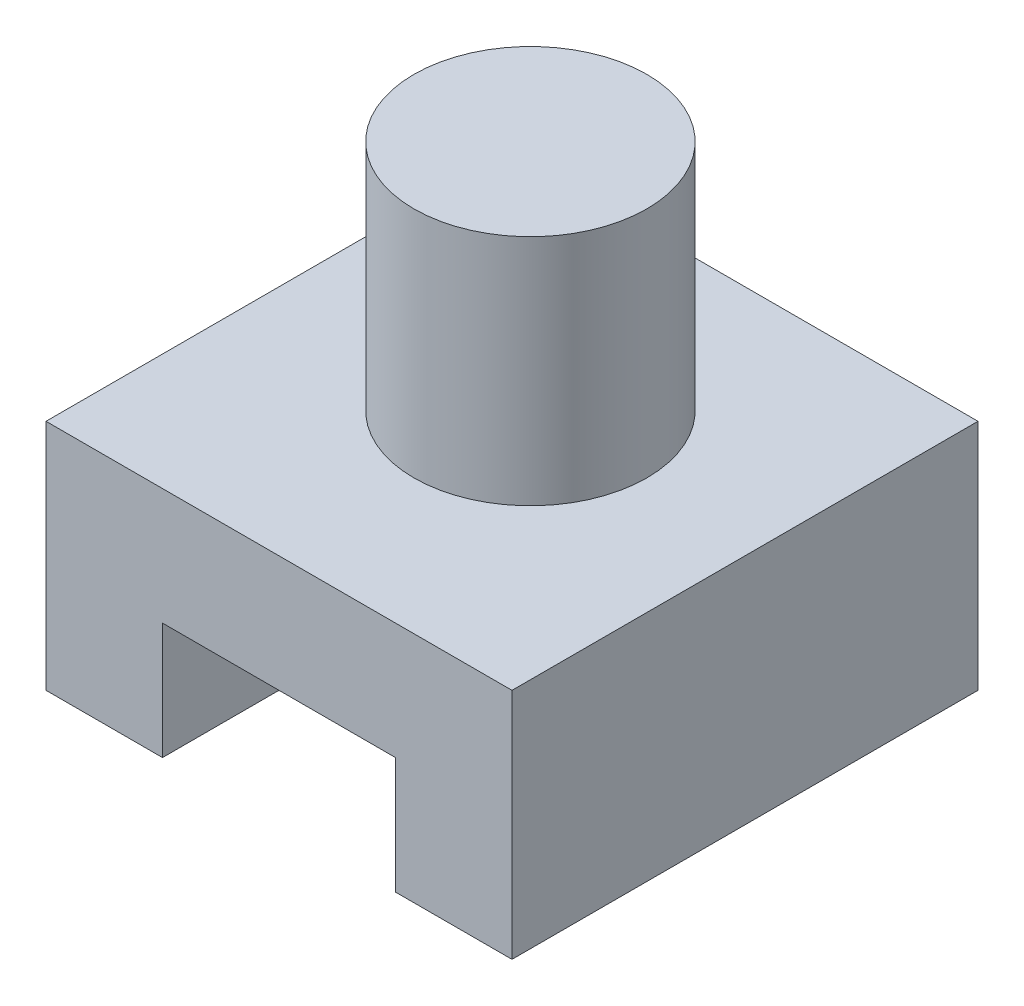
ISO-10303-21;
HEADER;
FILE_DESCRIPTION(('STEP AP214'),'2;1');
FILE_NAME('part.step','',(''),(''),'','','');
FILE_SCHEMA(('AUTOMOTIVE_DESIGN { 1 0 10303 214 1 1 1 1 }'));
ENDSEC;
DATA;
#1=APPLICATION_CONTEXT('core data for automotive mechanical design processes');
#2=APPLICATION_PROTOCOL_DEFINITION('international standard','automotive_design',2000,#1);
#3=PRODUCT_CONTEXT('',#1,'mechanical');
#4=PRODUCT('Part','Part','',(#3));
#5=PRODUCT_RELATED_PRODUCT_CATEGORY('part','',(#4));
#6=PRODUCT_DEFINITION_FORMATION('','',#4);
#7=PRODUCT_DEFINITION_CONTEXT('part definition',#1,'design');
#8=PRODUCT_DEFINITION('design','',#6,#7);
#9=PRODUCT_DEFINITION_SHAPE('','',#8);
#10=(LENGTH_UNIT() NAMED_UNIT(*) SI_UNIT(.MILLI.,.METRE.));
#11=(NAMED_UNIT(*) PLANE_ANGLE_UNIT() SI_UNIT($,.RADIAN.));
#12=(NAMED_UNIT(*) SI_UNIT($,.STERADIAN.) SOLID_ANGLE_UNIT());
#13=UNCERTAINTY_MEASURE_WITH_UNIT(LENGTH_MEASURE(1.E-05),#10,'distance_accuracy_value','');
#14=(GEOMETRIC_REPRESENTATION_CONTEXT(3) GLOBAL_UNCERTAINTY_ASSIGNED_CONTEXT((#13)) GLOBAL_UNIT_ASSIGNED_CONTEXT((#10,
#11,#12)) REPRESENTATION_CONTEXT('',''));
#15=CARTESIAN_POINT('',(0.,0.,0.));
#16=DIRECTION('',(0.,0.,1.));
#17=DIRECTION('',(1.,0.,0.));
#18=AXIS2_PLACEMENT_3D('',#15,#16,#17);
#19=CARTESIAN_POINT('',(0.,20.,-40.));
#20=DIRECTION('',(1.,0.,0.));
#21=DIRECTION('',(0.,0.,-1.));
#22=AXIS2_PLACEMENT_3D('',#19,#20,#21);
#23=PLANE('',#22);
#24=DIRECTION('',(0.,0.,1.));
#25=VECTOR('',#24,1.);
#26=CARTESIAN_POINT('',(0.,0.,-40.));
#27=LINE('',#26,#25);
#28=CARTESIAN_POINT('',(0.,0.,-40.));
#29=VERTEX_POINT('',#28);
#30=CARTESIAN_POINT('',(0.,0.,0.));
#31=VERTEX_POINT('',#30);
#32=EDGE_CURVE('E149',#29,#31,#27,.T.);
#33=ORIENTED_EDGE('',*,*,#32,.T.);
#34=DIRECTION('',(0.,-1.,0.));
#35=VECTOR('',#34,1.);
#36=CARTESIAN_POINT('',(0.,20.,0.));
#37=LINE('',#36,#35);
#38=CARTESIAN_POINT('',(0.,20.,0.));
#39=VERTEX_POINT('',#38);
#40=EDGE_CURVE('E42',#39,#31,#37,.T.);
#41=ORIENTED_EDGE('',*,*,#40,.F.);
#42=DIRECTION('',(0.,0.,1.));
#43=VECTOR('',#42,1.);
#44=CARTESIAN_POINT('',(0.,20.,-40.));
#45=LINE('',#44,#43);
#46=CARTESIAN_POINT('',(0.,20.,-40.));
#47=VERTEX_POINT('',#46);
#48=EDGE_CURVE('E142',#47,#39,#45,.T.);
#49=ORIENTED_EDGE('',*,*,#48,.F.);
#50=DIRECTION('',(0.,-1.,0.));
#51=VECTOR('',#50,1.);
#52=CARTESIAN_POINT('',(0.,20.,-40.));
#53=LINE('',#52,#51);
#54=EDGE_CURVE('E148',#47,#29,#53,.T.);
#55=ORIENTED_EDGE('',*,*,#54,.T.);
#56=EDGE_LOOP('',(#33,#41,#49,#55));
#57=FACE_BOUND('',#56,.T.);
#58=ADVANCED_FACE('F39',(#57),#23,.F.);
#59=CARTESIAN_POINT('',(0.,20.,0.));
#60=DIRECTION('',(0.,0.,-1.));
#61=DIRECTION('',(-1.,0.,0.));
#62=AXIS2_PLACEMENT_3D('',#59,#60,#61);
#63=PLANE('',#62);
#64=DIRECTION('',(1.,0.,0.));
#65=VECTOR('',#64,1.);
#66=CARTESIAN_POINT('',(0.,0.,0.));
#67=LINE('',#66,#65);
#68=CARTESIAN_POINT('',(10.,0.,0.));
#69=VERTEX_POINT('',#68);
#70=EDGE_CURVE('E153',#31,#69,#67,.T.);
#71=ORIENTED_EDGE('',*,*,#70,.T.);
#72=DIRECTION('',(0.,-1.,0.));
#73=VECTOR('',#72,1.);
#74=CARTESIAN_POINT('',(10.,0.,0.));
#75=LINE('',#74,#73);
#76=CARTESIAN_POINT('',(10.,10.,0.));
#77=VERTEX_POINT('',#76);
#78=EDGE_CURVE('E130',#77,#69,#75,.T.);
#79=ORIENTED_EDGE('',*,*,#78,.F.);
#80=DIRECTION('',(-1.,0.,0.));
#81=VECTOR('',#80,1.);
#82=CARTESIAN_POINT('',(10.,10.,0.));
#83=LINE('',#82,#81);
#84=CARTESIAN_POINT('',(30.,10.,0.));
#85=VERTEX_POINT('',#84);
#86=EDGE_CURVE('E175',#85,#77,#83,.T.);
#87=ORIENTED_EDGE('',*,*,#86,.F.);
#88=DIRECTION('',(0.,1.,0.));
#89=VECTOR('',#88,1.);
#90=CARTESIAN_POINT('',(30.,10.,0.));
#91=LINE('',#90,#89);
#92=CARTESIAN_POINT('',(30.,0.,0.));
#93=VERTEX_POINT('',#92);
#94=EDGE_CURVE('E178',#93,#85,#91,.T.);
#95=ORIENTED_EDGE('',*,*,#94,.F.);
#96=CARTESIAN_POINT('',(40.,0.,0.));
#97=VERTEX_POINT('',#96);
#98=EDGE_CURVE('E135',#93,#97,#67,.T.);
#99=ORIENTED_EDGE('',*,*,#98,.T.);
#100=DIRECTION('',(0.,-1.,0.));
#101=VECTOR('',#100,1.);
#102=CARTESIAN_POINT('',(40.,20.,0.));
#103=LINE('',#102,#101);
#104=CARTESIAN_POINT('',(40.,20.,0.));
#105=VERTEX_POINT('',#104);
#106=EDGE_CURVE('E161',#105,#97,#103,.T.);
#107=ORIENTED_EDGE('',*,*,#106,.F.);
#108=DIRECTION('',(1.,0.,0.));
#109=VECTOR('',#108,1.);
#110=CARTESIAN_POINT('',(0.,20.,0.));
#111=LINE('',#110,#109);
#112=EDGE_CURVE('E92',#39,#105,#111,.T.);
#113=ORIENTED_EDGE('',*,*,#112,.F.);
#114=ORIENTED_EDGE('',*,*,#40,.T.);
#115=EDGE_LOOP('',(#71,#79,#87,#95,#99,#107,#113,#114));
#116=FACE_BOUND('',#115,.T.);
#117=ADVANCED_FACE('F166',(#116),#63,.F.);
#118=CARTESIAN_POINT('',(40.,20.,0.));
#119=DIRECTION('',(-1.,0.,0.));
#120=DIRECTION('',(0.,0.,1.));
#121=AXIS2_PLACEMENT_3D('',#118,#119,#120);
#122=PLANE('',#121);
#123=DIRECTION('',(0.,0.,-1.));
#124=VECTOR('',#123,1.);
#125=CARTESIAN_POINT('',(40.,0.,0.));
#126=LINE('',#125,#124);
#127=CARTESIAN_POINT('',(40.,0.,-40.));
#128=VERTEX_POINT('',#127);
#129=EDGE_CURVE('E156',#97,#128,#126,.T.);
#130=ORIENTED_EDGE('',*,*,#129,.T.);
#131=DIRECTION('',(0.,-1.,0.));
#132=VECTOR('',#131,1.);
#133=CARTESIAN_POINT('',(40.,20.,-40.));
#134=LINE('',#133,#132);
#135=CARTESIAN_POINT('',(40.,20.,-40.));
#136=VERTEX_POINT('',#135);
#137=EDGE_CURVE('E160',#136,#128,#134,.T.);
#138=ORIENTED_EDGE('',*,*,#137,.F.);
#139=DIRECTION('',(0.,0.,-1.));
#140=VECTOR('',#139,1.);
#141=CARTESIAN_POINT('',(40.,20.,0.));
#142=LINE('',#141,#140);
#143=EDGE_CURVE('E145',#105,#136,#142,.T.);
#144=ORIENTED_EDGE('',*,*,#143,.F.);
#145=ORIENTED_EDGE('',*,*,#106,.T.);
#146=EDGE_LOOP('',(#130,#138,#144,#145));
#147=FACE_BOUND('',#146,.T.);
#148=ADVANCED_FACE('F198',(#147),#122,.F.);
#149=CARTESIAN_POINT('',(40.,20.,-40.));
#150=DIRECTION('',(0.,0.,1.));
#151=DIRECTION('',(1.,0.,0.));
#152=AXIS2_PLACEMENT_3D('',#149,#150,#151);
#153=PLANE('',#152);
#154=DIRECTION('',(-1.,0.,0.));
#155=VECTOR('',#154,1.);
#156=CARTESIAN_POINT('',(40.,0.,-40.));
#157=LINE('',#156,#155);
#158=EDGE_CURVE('E84',#128,#29,#157,.T.);
#159=ORIENTED_EDGE('',*,*,#158,.T.);
#160=ORIENTED_EDGE('',*,*,#54,.F.);
#161=DIRECTION('',(-1.,0.,0.));
#162=VECTOR('',#161,1.);
#163=CARTESIAN_POINT('',(40.,20.,-40.));
#164=LINE('',#163,#162);
#165=EDGE_CURVE('E63',#136,#47,#164,.T.);
#166=ORIENTED_EDGE('',*,*,#165,.F.);
#167=ORIENTED_EDGE('',*,*,#137,.T.);
#168=EDGE_LOOP('',(#159,#160,#166,#167));
#169=FACE_BOUND('',#168,.T.);
#170=ADVANCED_FACE('F195',(#169),#153,.F.);
#171=CARTESIAN_POINT('',(0.,20.,0.));
#172=DIRECTION('',(0.,1.,0.));
#173=DIRECTION('',(0.,0.,1.));
#174=AXIS2_PLACEMENT_3D('',#171,#172,#173);
#175=PLANE('',#174);
#176=CARTESIAN_POINT('',(20.,20.,-21.5793527371334));
#177=DIRECTION('',(0.,1.,0.));
#178=DIRECTION('',(0.,0.,1.));
#179=AXIS2_PLACEMENT_3D('',#176,#177,#178);
#180=CIRCLE('',#179,10.);
#181=CARTESIAN_POINT('',(20.,20.,-11.5793527371334));
#182=VERTEX_POINT('',#181);
#183=EDGE_CURVE('E11',#182,#182,#180,.T.);
#184=ORIENTED_EDGE('',*,*,#183,.F.);
#185=EDGE_LOOP('',(#184));
#186=FACE_BOUND('',#185,.T.);
#187=ORIENTED_EDGE('',*,*,#48,.T.);
#188=ORIENTED_EDGE('',*,*,#112,.T.);
#189=ORIENTED_EDGE('',*,*,#143,.T.);
#190=ORIENTED_EDGE('',*,*,#165,.T.);
#191=EDGE_LOOP('',(#187,#188,#189,#190));
#192=FACE_BOUND('',#191,.T.);
#193=ADVANCED_FACE('F193',(#186,#192),#175,.T.);
#194=CARTESIAN_POINT('',(0.,0.,0.));
#195=DIRECTION('',(0.,1.,0.));
#196=DIRECTION('',(0.,0.,1.));
#197=AXIS2_PLACEMENT_3D('',#194,#195,#196);
#198=PLANE('',#197);
#199=DIRECTION('',(1.,0.,0.));
#200=VECTOR('',#199,1.);
#201=CARTESIAN_POINT('',(30.,0.,-20.));
#202=LINE('',#201,#200);
#203=CARTESIAN_POINT('',(10.,0.,-20.));
#204=VERTEX_POINT('',#203);
#205=CARTESIAN_POINT('',(30.,0.,-20.));
#206=VERTEX_POINT('',#205);
#207=EDGE_CURVE('E124',#204,#206,#202,.T.);
#208=ORIENTED_EDGE('',*,*,#207,.F.);
#209=DIRECTION('',(0.,0.,1.));
#210=VECTOR('',#209,1.);
#211=CARTESIAN_POINT('',(10.,0.,-20.));
#212=LINE('',#211,#210);
#213=EDGE_CURVE('E152',#204,#69,#212,.T.);
#214=ORIENTED_EDGE('',*,*,#213,.T.);
#215=ORIENTED_EDGE('',*,*,#70,.F.);
#216=ORIENTED_EDGE('',*,*,#32,.F.);
#217=ORIENTED_EDGE('',*,*,#158,.F.);
#218=ORIENTED_EDGE('',*,*,#129,.F.);
#219=ORIENTED_EDGE('',*,*,#98,.F.);
#220=DIRECTION('',(0.,0.,1.));
#221=VECTOR('',#220,1.);
#222=CARTESIAN_POINT('',(30.,0.,-20.));
#223=LINE('',#222,#221);
#224=EDGE_CURVE('E119',#206,#93,#223,.T.);
#225=ORIENTED_EDGE('',*,*,#224,.F.);
#226=EDGE_LOOP('',(#208,#214,#215,#216,#217,#218,#219,#225));
#227=FACE_BOUND('',#226,.T.);
#228=ADVANCED_FACE('F133',(#227),#198,.F.);
#229=CARTESIAN_POINT('',(10.,0.,-20.));
#230=DIRECTION('',(-1.,0.,0.));
#231=DIRECTION('',(0.,0.,1.));
#232=AXIS2_PLACEMENT_3D('',#229,#230,#231);
#233=PLANE('',#232);
#234=ORIENTED_EDGE('',*,*,#78,.T.);
#235=ORIENTED_EDGE('',*,*,#213,.F.);
#236=DIRECTION('',(0.,-1.,0.));
#237=VECTOR('',#236,1.);
#238=CARTESIAN_POINT('',(10.,0.,-20.));
#239=LINE('',#238,#237);
#240=CARTESIAN_POINT('',(10.,10.,-20.));
#241=VERTEX_POINT('',#240);
#242=EDGE_CURVE('E54',#241,#204,#239,.T.);
#243=ORIENTED_EDGE('',*,*,#242,.F.);
#244=DIRECTION('',(0.,0.,1.));
#245=VECTOR('',#244,1.);
#246=CARTESIAN_POINT('',(10.,10.,-20.));
#247=LINE('',#246,#245);
#248=EDGE_CURVE('E137',#241,#77,#247,.T.);
#249=ORIENTED_EDGE('',*,*,#248,.T.);
#250=EDGE_LOOP('',(#234,#235,#243,#249));
#251=FACE_BOUND('',#250,.T.);
#252=ADVANCED_FACE('F220',(#251),#233,.F.);
#253=CARTESIAN_POINT('',(10.,10.,-20.));
#254=DIRECTION('',(0.,1.,0.));
#255=DIRECTION('',(0.,0.,1.));
#256=AXIS2_PLACEMENT_3D('',#253,#254,#255);
#257=PLANE('',#256);
#258=ORIENTED_EDGE('',*,*,#86,.T.);
#259=ORIENTED_EDGE('',*,*,#248,.F.);
#260=DIRECTION('',(-1.,0.,0.));
#261=VECTOR('',#260,1.);
#262=CARTESIAN_POINT('',(10.,10.,-20.));
#263=LINE('',#262,#261);
#264=CARTESIAN_POINT('',(30.,10.,-20.));
#265=VERTEX_POINT('',#264);
#266=EDGE_CURVE('E123',#265,#241,#263,.T.);
#267=ORIENTED_EDGE('',*,*,#266,.F.);
#268=DIRECTION('',(0.,0.,1.));
#269=VECTOR('',#268,1.);
#270=CARTESIAN_POINT('',(30.,10.,-20.));
#271=LINE('',#270,#269);
#272=EDGE_CURVE('E121',#265,#85,#271,.T.);
#273=ORIENTED_EDGE('',*,*,#272,.T.);
#274=EDGE_LOOP('',(#258,#259,#267,#273));
#275=FACE_BOUND('',#274,.T.);
#276=ADVANCED_FACE('F228',(#275),#257,.F.);
#277=CARTESIAN_POINT('',(30.,10.,-20.));
#278=DIRECTION('',(1.,0.,0.));
#279=DIRECTION('',(0.,0.,-1.));
#280=AXIS2_PLACEMENT_3D('',#277,#278,#279);
#281=PLANE('',#280);
#282=ORIENTED_EDGE('',*,*,#94,.T.);
#283=ORIENTED_EDGE('',*,*,#272,.F.);
#284=DIRECTION('',(0.,1.,0.));
#285=VECTOR('',#284,1.);
#286=CARTESIAN_POINT('',(30.,10.,-20.));
#287=LINE('',#286,#285);
#288=EDGE_CURVE('E115',#206,#265,#287,.T.);
#289=ORIENTED_EDGE('',*,*,#288,.F.);
#290=ORIENTED_EDGE('',*,*,#224,.T.);
#291=EDGE_LOOP('',(#282,#283,#289,#290));
#292=FACE_BOUND('',#291,.T.);
#293=ADVANCED_FACE('F117',(#292),#281,.F.);
#294=CARTESIAN_POINT('',(0.,0.,-20.));
#295=DIRECTION('',(0.,0.,-1.));
#296=DIRECTION('',(-1.,0.,0.));
#297=AXIS2_PLACEMENT_3D('',#294,#295,#296);
#298=PLANE('',#297);
#299=ORIENTED_EDGE('',*,*,#207,.T.);
#300=ORIENTED_EDGE('',*,*,#288,.T.);
#301=ORIENTED_EDGE('',*,*,#266,.T.);
#302=ORIENTED_EDGE('',*,*,#242,.T.);
#303=EDGE_LOOP('',(#299,#300,#301,#302));
#304=FACE_BOUND('',#303,.T.);
#305=ADVANCED_FACE('F127',(#304),#298,.F.);
#306=CARTESIAN_POINT('',(20.,40.,-21.5793527371334));
#307=DIRECTION('',(0.,-1.,0.));
#308=DIRECTION('',(0.,0.,-1.));
#309=AXIS2_PLACEMENT_3D('',#306,#307,#308);
#310=CYLINDRICAL_SURFACE('',#309,10.);
#311=CARTESIAN_POINT('',(20.,40.,-21.5793527371334));
#312=DIRECTION('',(0.,1.,0.));
#313=DIRECTION('',(0.,0.,1.));
#314=AXIS2_PLACEMENT_3D('',#311,#312,#313);
#315=CIRCLE('',#314,10.);
#316=CARTESIAN_POINT('',(20.,40.,-11.5793527371334));
#317=VERTEX_POINT('',#316);
#318=EDGE_CURVE('E179',#317,#317,#315,.T.);
#319=ORIENTED_EDGE('',*,*,#318,.F.);
#320=EDGE_LOOP('',(#319));
#321=FACE_BOUND('',#320,.T.);
#322=ORIENTED_EDGE('',*,*,#183,.T.);
#323=EDGE_LOOP('',(#322));
#324=FACE_BOUND('',#323,.T.);
#325=ADVANCED_FACE('F187',(#321,#324),#310,.T.);
#326=CARTESIAN_POINT('',(20.,40.,-21.5793527371334));
#327=DIRECTION('',(0.,1.,0.));
#328=DIRECTION('',(0.,0.,1.));
#329=AXIS2_PLACEMENT_3D('',#326,#327,#328);
#330=PLANE('',#329);
#331=ORIENTED_EDGE('',*,*,#318,.T.);
#332=EDGE_LOOP('',(#331));
#333=FACE_BOUND('',#332,.T.);
#334=ADVANCED_FACE('F185',(#333),#330,.T.);
#335=CLOSED_SHELL('',(#58,#117,#148,#170,#193,#228,#252,#276,#293,#305,#325,#334));
#336=MANIFOLD_SOLID_BREP('B2',#335);
#337=ADVANCED_BREP_SHAPE_REPRESENTATION('',(#18,#336),#14);
#338=SHAPE_DEFINITION_REPRESENTATION(#9,#337);
ENDSEC;
END-ISO-10303-21;
